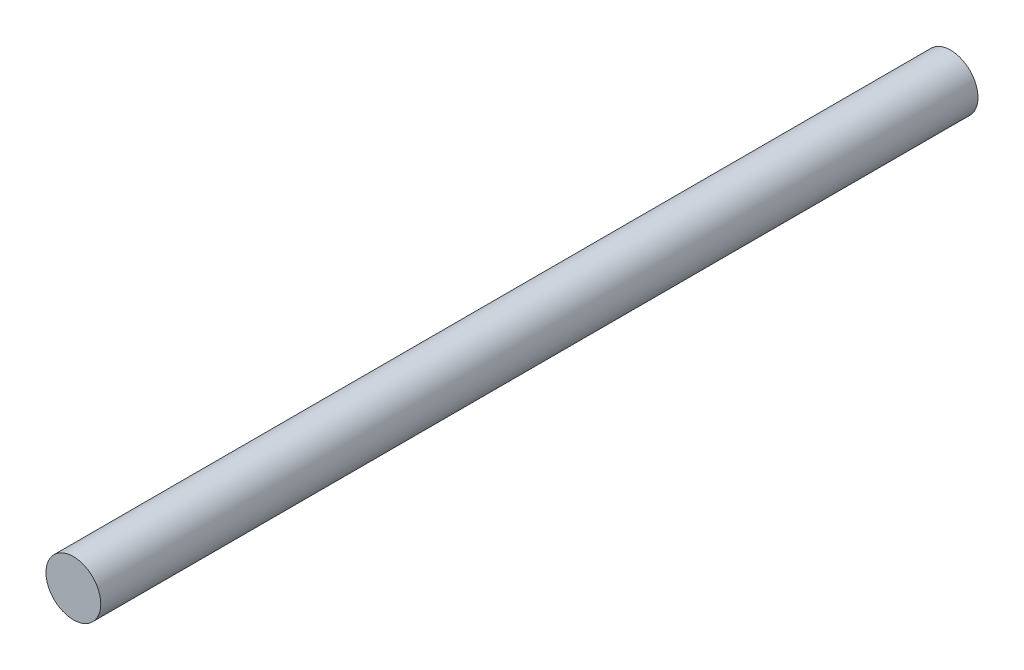
ISO-10303-21;
HEADER;
FILE_DESCRIPTION(('STEP AP214'),'2;1');
FILE_NAME('part.step','',(''),(''),'','','');
FILE_SCHEMA(('AUTOMOTIVE_DESIGN { 1 0 10303 214 1 1 1 1 }'));
ENDSEC;
DATA;
#1=APPLICATION_CONTEXT('core data for automotive mechanical design processes');
#2=APPLICATION_PROTOCOL_DEFINITION('international standard','automotive_design',2000,#1);
#3=PRODUCT_CONTEXT('',#1,'mechanical');
#4=PRODUCT('Part','Part','',(#3));
#5=PRODUCT_RELATED_PRODUCT_CATEGORY('part','',(#4));
#6=PRODUCT_DEFINITION_FORMATION('','',#4);
#7=PRODUCT_DEFINITION_CONTEXT('part definition',#1,'design');
#8=PRODUCT_DEFINITION('design','',#6,#7);
#9=PRODUCT_DEFINITION_SHAPE('','',#8);
#10=(LENGTH_UNIT() NAMED_UNIT(*) SI_UNIT(.MILLI.,.METRE.));
#11=(NAMED_UNIT(*) PLANE_ANGLE_UNIT() SI_UNIT($,.RADIAN.));
#12=(NAMED_UNIT(*) SI_UNIT($,.STERADIAN.) SOLID_ANGLE_UNIT());
#13=UNCERTAINTY_MEASURE_WITH_UNIT(LENGTH_MEASURE(1.E-05),#10,'distance_accuracy_value','');
#14=(GEOMETRIC_REPRESENTATION_CONTEXT(3) GLOBAL_UNCERTAINTY_ASSIGNED_CONTEXT((#13)) GLOBAL_UNIT_ASSIGNED_CONTEXT((#10,
#11,#12)) REPRESENTATION_CONTEXT('',''));
#15=CARTESIAN_POINT('',(0.,0.,0.));
#16=DIRECTION('',(0.,0.,1.));
#17=DIRECTION('',(1.,0.,0.));
#18=AXIS2_PLACEMENT_3D('',#15,#16,#17);
#19=CARTESIAN_POINT('',(0.,0.,32.));
#20=DIRECTION('',(0.,0.,-1.));
#21=DIRECTION('',(-1.,0.,0.));
#22=AXIS2_PLACEMENT_3D('',#19,#20,#21);
#23=CYLINDRICAL_SURFACE('',#22,1.);
#24=CARTESIAN_POINT('',(0.,0.,32.));
#25=DIRECTION('',(0.,0.,1.));
#26=DIRECTION('',(1.,0.,0.));
#27=AXIS2_PLACEMENT_3D('',#24,#25,#26);
#28=CIRCLE('',#27,1.);
#29=CARTESIAN_POINT('',(1.,0.,32.));
#30=VERTEX_POINT('',#29);
#31=EDGE_CURVE('E10',#30,#30,#28,.T.);
#32=ORIENTED_EDGE('',*,*,#31,.F.);
#33=EDGE_LOOP('',(#32));
#34=FACE_BOUND('',#33,.T.);
#35=CARTESIAN_POINT('',(0.,0.,0.));
#36=DIRECTION('',(0.,0.,1.));
#37=DIRECTION('',(1.,0.,0.));
#38=AXIS2_PLACEMENT_3D('',#35,#36,#37);
#39=CIRCLE('',#38,1.);
#40=CARTESIAN_POINT('',(1.,0.,0.));
#41=VERTEX_POINT('',#40);
#42=EDGE_CURVE('E33',#41,#41,#39,.T.);
#43=ORIENTED_EDGE('',*,*,#42,.T.);
#44=EDGE_LOOP('',(#43));
#45=FACE_BOUND('',#44,.T.);
#46=ADVANCED_FACE('F30',(#34,#45),#23,.T.);
#47=CARTESIAN_POINT('',(0.,0.,32.));
#48=DIRECTION('',(0.,0.,1.));
#49=DIRECTION('',(1.,0.,0.));
#50=AXIS2_PLACEMENT_3D('',#47,#48,#49);
#51=PLANE('',#50);
#52=ORIENTED_EDGE('',*,*,#31,.T.);
#53=EDGE_LOOP('',(#52));
#54=FACE_BOUND('',#53,.T.);
#55=ADVANCED_FACE('F45',(#54),#51,.T.);
#56=CARTESIAN_POINT('',(0.,0.,0.));
#57=DIRECTION('',(0.,0.,1.));
#58=DIRECTION('',(1.,0.,0.));
#59=AXIS2_PLACEMENT_3D('',#56,#57,#58);
#60=PLANE('',#59);
#61=ORIENTED_EDGE('',*,*,#42,.F.);
#62=EDGE_LOOP('',(#61));
#63=FACE_BOUND('',#62,.T.);
#64=ADVANCED_FACE('F43',(#63),#60,.F.);
#65=CLOSED_SHELL('',(#46,#55,#64));
#66=MANIFOLD_SOLID_BREP('B2',#65);
#67=ADVANCED_BREP_SHAPE_REPRESENTATION('',(#18,#66),#14);
#68=SHAPE_DEFINITION_REPRESENTATION(#9,#67);
ENDSEC;
END-ISO-10303-21;
